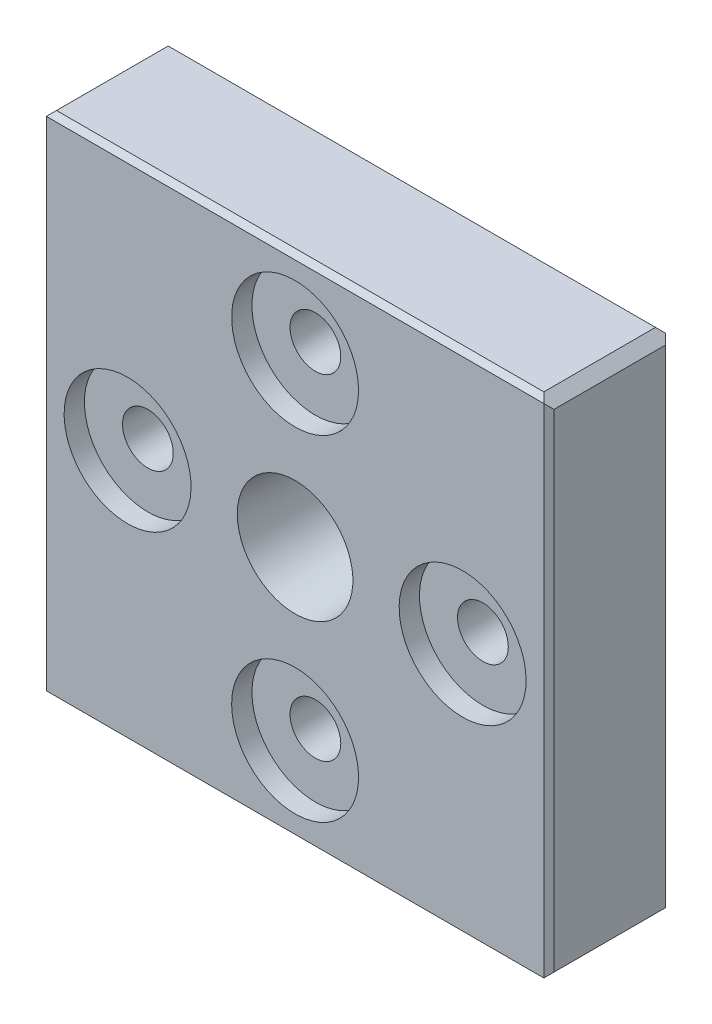
ISO-10303-21;
HEADER;
FILE_DESCRIPTION(('STEP AP214'),'2;1');
FILE_NAME('part.step','',(''),(''),'','','');
FILE_SCHEMA(('AUTOMOTIVE_DESIGN { 1 0 10303 214 1 1 1 1 }'));
ENDSEC;
DATA;
#1=APPLICATION_CONTEXT('core data for automotive mechanical design processes');
#2=APPLICATION_PROTOCOL_DEFINITION('international standard','automotive_design',2000,#1);
#3=PRODUCT_CONTEXT('',#1,'mechanical');
#4=PRODUCT('Part','Part','',(#3));
#5=PRODUCT_RELATED_PRODUCT_CATEGORY('part','',(#4));
#6=PRODUCT_DEFINITION_FORMATION('','',#4);
#7=PRODUCT_DEFINITION_CONTEXT('part definition',#1,'design');
#8=PRODUCT_DEFINITION('design','',#6,#7);
#9=PRODUCT_DEFINITION_SHAPE('','',#8);
#10=(LENGTH_UNIT() NAMED_UNIT(*) SI_UNIT(.MILLI.,.METRE.));
#11=(NAMED_UNIT(*) PLANE_ANGLE_UNIT() SI_UNIT($,.RADIAN.));
#12=(NAMED_UNIT(*) SI_UNIT($,.STERADIAN.) SOLID_ANGLE_UNIT());
#13=UNCERTAINTY_MEASURE_WITH_UNIT(LENGTH_MEASURE(1.E-05),#10,'distance_accuracy_value','');
#14=(GEOMETRIC_REPRESENTATION_CONTEXT(3) GLOBAL_UNCERTAINTY_ASSIGNED_CONTEXT((#13)) GLOBAL_UNIT_ASSIGNED_CONTEXT((#10,
#11,#12)) REPRESENTATION_CONTEXT('',''));
#15=CARTESIAN_POINT('',(0.,0.,0.));
#16=DIRECTION('',(0.,0.,1.));
#17=DIRECTION('',(1.,0.,0.));
#18=AXIS2_PLACEMENT_3D('',#15,#16,#17);
#19=CARTESIAN_POINT('',(0.,0.,-6.00100000000001));
#20=DIRECTION('',(0.,0.,1.));
#21=DIRECTION('',(0.999999999999999,0.,0.));
#22=AXIS2_PLACEMENT_3D('',#19,#20,#21);
#23=CYLINDRICAL_SURFACE('',#22,5.);
#24=CARTESIAN_POINT('',(0.,0.,-6.00000000000001));
#25=DIRECTION('',(0.,0.,-1.));
#26=DIRECTION('',(-0.999999999999999,0.,0.));
#27=AXIS2_PLACEMENT_3D('',#24,#25,#26);
#28=CIRCLE('',#27,5.);
#29=CARTESIAN_POINT('',(-4.99999999999998,0.,-6.00000000000001));
#30=VERTEX_POINT('',#29);
#31=EDGE_CURVE('E315',#30,#30,#28,.F.);
#32=ORIENTED_EDGE('',*,*,#31,.F.);
#33=EDGE_LOOP('',(#32));
#34=FACE_BOUND('',#33,.T.);
#35=CARTESIAN_POINT('',(0.,0.,-2.8));
#36=DIRECTION('',(0.,0.,1.));
#37=DIRECTION('',(-0.999999999999999,0.,0.));
#38=AXIS2_PLACEMENT_3D('',#35,#36,#37);
#39=CIRCLE('',#38,5.);
#40=CARTESIAN_POINT('',(-4.99999999999998,0.,-2.8));
#41=VERTEX_POINT('',#40);
#42=EDGE_CURVE('E12',#41,#41,#39,.T.);
#43=ORIENTED_EDGE('',*,*,#42,.T.);
#44=EDGE_LOOP('',(#43));
#45=FACE_BOUND('',#44,.T.);
#46=ADVANCED_FACE('F50',(#34,#45),#23,.F.);
#47=CARTESIAN_POINT('',(0.,-16.5,6.00000000000001));
#48=DIRECTION('',(0.,0.,1.));
#49=DIRECTION('',(0.999999999999999,0.,0.));
#50=AXIS2_PLACEMENT_3D('',#47,#48,#49);
#51=CYLINDRICAL_SURFACE('',#50,2.5);
#52=CARTESIAN_POINT('',(0.,-16.5,-6.00000000000001));
#53=DIRECTION('',(0.,0.,1.));
#54=DIRECTION('',(0.999999999999999,0.,0.));
#55=AXIS2_PLACEMENT_3D('',#52,#53,#54);
#56=CIRCLE('',#55,2.5);
#57=CARTESIAN_POINT('',(2.5,-16.5,-6.00000000000001));
#58=VERTEX_POINT('',#57);
#59=EDGE_CURVE('E311',#58,#58,#56,.T.);
#60=ORIENTED_EDGE('',*,*,#59,.F.);
#61=EDGE_LOOP('',(#60));
#62=FACE_BOUND('',#61,.T.);
#63=CARTESIAN_POINT('',(0.,-16.5,4.));
#64=DIRECTION('',(0.,0.,1.));
#65=DIRECTION('',(0.999999999999999,0.,0.));
#66=AXIS2_PLACEMENT_3D('',#63,#64,#65);
#67=CIRCLE('',#66,2.5);
#68=CARTESIAN_POINT('',(2.5,-16.5,4.));
#69=VERTEX_POINT('',#68);
#70=EDGE_CURVE('E282',#69,#69,#67,.F.);
#71=ORIENTED_EDGE('',*,*,#70,.F.);
#72=EDGE_LOOP('',(#71));
#73=FACE_BOUND('',#72,.T.);
#74=ADVANCED_FACE('F386',(#62,#73),#51,.F.);
#75=CARTESIAN_POINT('',(16.5,0.,6.00000000000002));
#76=DIRECTION('',(0.,0.,1.));
#77=DIRECTION('',(0.999999999999999,0.,0.));
#78=AXIS2_PLACEMENT_3D('',#75,#76,#77);
#79=CYLINDRICAL_SURFACE('',#78,2.5);
#80=CARTESIAN_POINT('',(16.5,0.,-5.99999999999998));
#81=DIRECTION('',(0.,0.,1.));
#82=DIRECTION('',(0.999999999999999,0.,0.));
#83=AXIS2_PLACEMENT_3D('',#80,#81,#82);
#84=CIRCLE('',#83,2.5);
#85=CARTESIAN_POINT('',(19.,0.,-5.99999999999998));
#86=VERTEX_POINT('',#85);
#87=EDGE_CURVE('E307',#86,#86,#84,.T.);
#88=ORIENTED_EDGE('',*,*,#87,.F.);
#89=EDGE_LOOP('',(#88));
#90=FACE_BOUND('',#89,.T.);
#91=CARTESIAN_POINT('',(16.5,0.,4.00000000000002));
#92=DIRECTION('',(0.,0.,1.));
#93=DIRECTION('',(0.999999999999999,0.,0.));
#94=AXIS2_PLACEMENT_3D('',#91,#92,#93);
#95=CIRCLE('',#94,2.5);
#96=CARTESIAN_POINT('',(19.,0.,4.00000000000002));
#97=VERTEX_POINT('',#96);
#98=EDGE_CURVE('E277',#97,#97,#95,.F.);
#99=ORIENTED_EDGE('',*,*,#98,.F.);
#100=EDGE_LOOP('',(#99));
#101=FACE_BOUND('',#100,.T.);
#102=ADVANCED_FACE('F395',(#90,#101),#79,.F.);
#103=CARTESIAN_POINT('',(-16.5,0.,6.00000000000001));
#104=DIRECTION('',(0.,0.,1.));
#105=DIRECTION('',(0.999999999999999,0.,0.));
#106=AXIS2_PLACEMENT_3D('',#103,#104,#105);
#107=CYLINDRICAL_SURFACE('',#106,2.5);
#108=CARTESIAN_POINT('',(-16.5,0.,-5.99999999999999));
#109=DIRECTION('',(0.,0.,1.));
#110=DIRECTION('',(0.999999999999999,0.,0.));
#111=AXIS2_PLACEMENT_3D('',#108,#109,#110);
#112=CIRCLE('',#111,2.5);
#113=CARTESIAN_POINT('',(-14.,0.,-5.99999999999999));
#114=VERTEX_POINT('',#113);
#115=EDGE_CURVE('E271',#114,#114,#112,.T.);
#116=ORIENTED_EDGE('',*,*,#115,.F.);
#117=EDGE_LOOP('',(#116));
#118=FACE_BOUND('',#117,.T.);
#119=CARTESIAN_POINT('',(-16.5,0.,4.));
#120=DIRECTION('',(0.,0.,1.));
#121=DIRECTION('',(0.999999999999999,0.,0.));
#122=AXIS2_PLACEMENT_3D('',#119,#120,#121);
#123=CIRCLE('',#122,2.5);
#124=CARTESIAN_POINT('',(-14.,0.,4.));
#125=VERTEX_POINT('',#124);
#126=EDGE_CURVE('E273',#125,#125,#123,.F.);
#127=ORIENTED_EDGE('',*,*,#126,.F.);
#128=EDGE_LOOP('',(#127));
#129=FACE_BOUND('',#128,.T.);
#130=ADVANCED_FACE('F644',(#118,#129),#107,.F.);
#131=CARTESIAN_POINT('',(0.,16.5,6.00000000000001));
#132=DIRECTION('',(0.,0.,1.));
#133=DIRECTION('',(0.999999999999999,0.,0.));
#134=AXIS2_PLACEMENT_3D('',#131,#132,#133);
#135=CYLINDRICAL_SURFACE('',#134,2.5);
#136=CARTESIAN_POINT('',(0.,16.5,-6.00000000000001));
#137=DIRECTION('',(0.,0.,1.));
#138=DIRECTION('',(0.999999999999999,0.,0.));
#139=AXIS2_PLACEMENT_3D('',#136,#137,#138);
#140=CIRCLE('',#139,2.5);
#141=CARTESIAN_POINT('',(2.5,16.5,-6.00000000000001));
#142=VERTEX_POINT('',#141);
#143=EDGE_CURVE('E303',#142,#142,#140,.T.);
#144=ORIENTED_EDGE('',*,*,#143,.F.);
#145=EDGE_LOOP('',(#144));
#146=FACE_BOUND('',#145,.T.);
#147=CARTESIAN_POINT('',(0.,16.5,4.));
#148=DIRECTION('',(0.,0.,1.));
#149=DIRECTION('',(0.999999999999999,0.,0.));
#150=AXIS2_PLACEMENT_3D('',#147,#148,#149);
#151=CIRCLE('',#150,2.5);
#152=CARTESIAN_POINT('',(2.50000000000001,16.5,4.));
#153=VERTEX_POINT('',#152);
#154=EDGE_CURVE('E267',#153,#153,#151,.F.);
#155=ORIENTED_EDGE('',*,*,#154,.F.);
#156=EDGE_LOOP('',(#155));
#157=FACE_BOUND('',#156,.T.);
#158=ADVANCED_FACE('F421',(#146,#157),#135,.F.);
#159=CARTESIAN_POINT('',(25.,-25.,6.00000000000002));
#160=DIRECTION('',(-0.999999999999999,0.,0.));
#161=DIRECTION('',(0.,0.,1.));
#162=AXIS2_PLACEMENT_3D('',#159,#160,#161);
#163=PLANE('',#162);
#164=DIRECTION('',(0.,0.,-1.));
#165=VECTOR('',#164,1.);
#166=CARTESIAN_POINT('',(25.,-24.,6.00000000000002));
#167=LINE('',#166,#165);
#168=CARTESIAN_POINT('',(25.,-24.,5.50000000000001));
#169=VERTEX_POINT('',#168);
#170=CARTESIAN_POINT('',(25.,-24.,-5.49999999999998));
#171=VERTEX_POINT('',#170);
#172=EDGE_CURVE('E161',#169,#171,#167,.T.);
#173=ORIENTED_EDGE('',*,*,#172,.T.);
#174=DIRECTION('',(0.,0.999999999999999,0.));
#175=VECTOR('',#174,1.);
#176=CARTESIAN_POINT('',(25.,24.,-5.49999999999999));
#177=LINE('',#176,#175);
#178=CARTESIAN_POINT('',(25.,24.,-5.49999999999999));
#179=VERTEX_POINT('',#178);
#180=EDGE_CURVE('E258',#171,#179,#177,.T.);
#181=ORIENTED_EDGE('',*,*,#180,.T.);
#182=DIRECTION('',(0.,0.,1.));
#183=VECTOR('',#182,1.);
#184=CARTESIAN_POINT('',(25.,24.,6.00000000000002));
#185=LINE('',#184,#183);
#186=CARTESIAN_POINT('',(25.,24.,5.49999999999999));
#187=VERTEX_POINT('',#186);
#188=EDGE_CURVE('E319',#179,#187,#185,.T.);
#189=ORIENTED_EDGE('',*,*,#188,.T.);
#190=DIRECTION('',(0.,-0.999999999999999,0.));
#191=VECTOR('',#190,1.);
#192=CARTESIAN_POINT('',(25.,-25.,5.50000000000001));
#193=LINE('',#192,#191);
#194=EDGE_CURVE('E255',#187,#169,#193,.T.);
#195=ORIENTED_EDGE('',*,*,#194,.T.);
#196=EDGE_LOOP('',(#173,#181,#189,#195));
#197=FACE_BOUND('',#196,.T.);
#198=ADVANCED_FACE('F370',(#197),#163,.F.);
#199=CARTESIAN_POINT('',(-25.,25.,6.00000000000001));
#200=DIRECTION('',(0.,-0.999999999999999,0.));
#201=DIRECTION('',(0.,0.,-1.));
#202=AXIS2_PLACEMENT_3D('',#199,#200,#201);
#203=PLANE('',#202);
#204=DIRECTION('',(0.,0.,-1.));
#205=VECTOR('',#204,1.);
#206=CARTESIAN_POINT('',(24.,25.,6.00000000000002));
#207=LINE('',#206,#205);
#208=CARTESIAN_POINT('',(24.,25.,5.50000000000002));
#209=VERTEX_POINT('',#208);
#210=CARTESIAN_POINT('',(24.,25.,-5.49999999999999));
#211=VERTEX_POINT('',#210);
#212=EDGE_CURVE('E339',#209,#211,#207,.T.);
#213=ORIENTED_EDGE('',*,*,#212,.T.);
#214=DIRECTION('',(-0.999999999999999,0.,0.));
#215=VECTOR('',#214,1.);
#216=CARTESIAN_POINT('',(-24.,25.,-5.49999999999999));
#217=LINE('',#216,#215);
#218=CARTESIAN_POINT('',(-24.,25.,-5.49999999999999));
#219=VERTEX_POINT('',#218);
#220=EDGE_CURVE('E228',#211,#219,#217,.T.);
#221=ORIENTED_EDGE('',*,*,#220,.T.);
#222=DIRECTION('',(0.,0.,1.));
#223=VECTOR('',#222,1.);
#224=CARTESIAN_POINT('',(-24.,25.,6.00000000000001));
#225=LINE('',#224,#223);
#226=CARTESIAN_POINT('',(-24.,25.,5.50000000000001));
#227=VERTEX_POINT('',#226);
#228=EDGE_CURVE('E343',#219,#227,#225,.T.);
#229=ORIENTED_EDGE('',*,*,#228,.T.);
#230=DIRECTION('',(0.999999999999999,0.,0.));
#231=VECTOR('',#230,1.);
#232=CARTESIAN_POINT('',(-25.,25.,5.50000000000001));
#233=LINE('',#232,#231);
#234=EDGE_CURVE('E225',#227,#209,#233,.T.);
#235=ORIENTED_EDGE('',*,*,#234,.T.);
#236=EDGE_LOOP('',(#213,#221,#229,#235));
#237=FACE_BOUND('',#236,.T.);
#238=ADVANCED_FACE('F414',(#237),#203,.F.);
#239=CARTESIAN_POINT('',(-25.,-25.,6.00000000000001));
#240=DIRECTION('',(0.999999999999999,0.,0.));
#241=DIRECTION('',(0.,0.,-1.));
#242=AXIS2_PLACEMENT_3D('',#239,#240,#241);
#243=PLANE('',#242);
#244=DIRECTION('',(0.,0.,-1.));
#245=VECTOR('',#244,1.);
#246=CARTESIAN_POINT('',(-25.,24.,6.00000000000001));
#247=LINE('',#246,#245);
#248=CARTESIAN_POINT('',(-25.,24.,5.49999999999999));
#249=VERTEX_POINT('',#248);
#250=CARTESIAN_POINT('',(-25.,24.,-5.49999999999999));
#251=VERTEX_POINT('',#250);
#252=EDGE_CURVE('E331',#249,#251,#247,.T.);
#253=ORIENTED_EDGE('',*,*,#252,.T.);
#254=DIRECTION('',(0.,-0.999999999999999,0.));
#255=VECTOR('',#254,1.);
#256=CARTESIAN_POINT('',(-25.,-24.,-5.49999999999998));
#257=LINE('',#256,#255);
#258=CARTESIAN_POINT('',(-25.,-24.,-5.49999999999998));
#259=VERTEX_POINT('',#258);
#260=EDGE_CURVE('E60',#251,#259,#257,.T.);
#261=ORIENTED_EDGE('',*,*,#260,.T.);
#262=DIRECTION('',(0.,0.,1.));
#263=VECTOR('',#262,1.);
#264=CARTESIAN_POINT('',(-25.,-24.,6.00000000000001));
#265=LINE('',#264,#263);
#266=CARTESIAN_POINT('',(-25.,-24.,5.50000000000001));
#267=VERTEX_POINT('',#266);
#268=EDGE_CURVE('E335',#259,#267,#265,.T.);
#269=ORIENTED_EDGE('',*,*,#268,.T.);
#270=DIRECTION('',(0.,0.999999999999999,0.));
#271=VECTOR('',#270,1.);
#272=CARTESIAN_POINT('',(-25.,-25.,5.50000000000001));
#273=LINE('',#272,#271);
#274=EDGE_CURVE('E261',#267,#249,#273,.T.);
#275=ORIENTED_EDGE('',*,*,#274,.T.);
#276=EDGE_LOOP('',(#253,#261,#269,#275));
#277=FACE_BOUND('',#276,.T.);
#278=ADVANCED_FACE('F411',(#277),#243,.F.);
#279=CARTESIAN_POINT('',(-25.,-25.,6.00000000000001));
#280=DIRECTION('',(0.,0.999999999999999,0.));
#281=DIRECTION('',(0.,0.,1.));
#282=AXIS2_PLACEMENT_3D('',#279,#280,#281);
#283=PLANE('',#282);
#284=DIRECTION('',(0.,0.,1.));
#285=VECTOR('',#284,1.);
#286=CARTESIAN_POINT('',(24.,-25.,6.00000000000002));
#287=LINE('',#286,#285);
#288=CARTESIAN_POINT('',(24.,-25.,-5.49999999999998));
#289=VERTEX_POINT('',#288);
#290=CARTESIAN_POINT('',(24.,-25.,5.50000000000002));
#291=VERTEX_POINT('',#290);
#292=EDGE_CURVE('E328',#289,#291,#287,.T.);
#293=ORIENTED_EDGE('',*,*,#292,.T.);
#294=DIRECTION('',(-0.999999999999999,0.,0.));
#295=VECTOR('',#294,1.);
#296=CARTESIAN_POINT('',(-25.,-25.,5.50000000000001));
#297=LINE('',#296,#295);
#298=CARTESIAN_POINT('',(-24.,-25.,5.50000000000001));
#299=VERTEX_POINT('',#298);
#300=EDGE_CURVE('E149',#291,#299,#297,.T.);
#301=ORIENTED_EDGE('',*,*,#300,.T.);
#302=DIRECTION('',(0.,0.,-1.));
#303=VECTOR('',#302,1.);
#304=CARTESIAN_POINT('',(-24.,-25.,6.00000000000001));
#305=LINE('',#304,#303);
#306=CARTESIAN_POINT('',(-24.,-25.,-5.49999999999998));
#307=VERTEX_POINT('',#306);
#308=EDGE_CURVE('E324',#299,#307,#305,.T.);
#309=ORIENTED_EDGE('',*,*,#308,.T.);
#310=DIRECTION('',(0.999999999999999,0.,0.));
#311=VECTOR('',#310,1.);
#312=CARTESIAN_POINT('',(24.,-25.,-5.49999999999998));
#313=LINE('',#312,#311);
#314=EDGE_CURVE('E191',#307,#289,#313,.T.);
#315=ORIENTED_EDGE('',*,*,#314,.T.);
#316=EDGE_LOOP('',(#293,#301,#309,#315));
#317=FACE_BOUND('',#316,.T.);
#318=ADVANCED_FACE('F363',(#317),#283,.F.);
#319=CARTESIAN_POINT('',(0.,0.,6.00000000000001));
#320=DIRECTION('',(0.,0.,-1.));
#321=DIRECTION('',(-0.999999999999999,0.,0.));
#322=AXIS2_PLACEMENT_3D('',#319,#320,#321);
#323=PLANE('',#322);
#324=CARTESIAN_POINT('',(-16.5,0.,6.00000000000001));
#325=DIRECTION('',(0.,0.,1.));
#326=DIRECTION('',(0.,0.999999999999999,0.));
#327=AXIS2_PLACEMENT_3D('',#324,#325,#326);
#328=CIRCLE('',#327,6.25);
#329=CARTESIAN_POINT('',(-16.5,6.24999999999994,6.00000000000001));
#330=VERTEX_POINT('',#329);
#331=EDGE_CURVE('E595',#330,#330,#328,.T.);
#332=ORIENTED_EDGE('',*,*,#331,.F.);
#333=EDGE_LOOP('',(#332));
#334=FACE_BOUND('',#333,.T.);
#335=CARTESIAN_POINT('',(0.,-16.5,6.00000000000001));
#336=DIRECTION('',(0.,0.,1.));
#337=DIRECTION('',(-0.999999999999999,0.,0.));
#338=AXIS2_PLACEMENT_3D('',#335,#336,#337);
#339=CIRCLE('',#338,6.25);
#340=CARTESIAN_POINT('',(-6.24999999999998,-16.5,6.00000000000001));
#341=VERTEX_POINT('',#340);
#342=EDGE_CURVE('E585',#341,#341,#339,.T.);
#343=ORIENTED_EDGE('',*,*,#342,.F.);
#344=EDGE_LOOP('',(#343));
#345=FACE_BOUND('',#344,.T.);
#346=CARTESIAN_POINT('',(16.5,1.80411241501588E-13,6.00000000000002));
#347=DIRECTION('',(0.,0.,1.));
#348=DIRECTION('',(0.,-0.999999999999999,0.));
#349=AXIS2_PLACEMENT_3D('',#346,#347,#348);
#350=CIRCLE('',#349,6.25);
#351=CARTESIAN_POINT('',(16.5000000000001,-6.24999999999981,6.00000000000002));
#352=VERTEX_POINT('',#351);
#353=EDGE_CURVE('E577',#352,#352,#350,.T.);
#354=ORIENTED_EDGE('',*,*,#353,.F.);
#355=EDGE_LOOP('',(#354));
#356=FACE_BOUND('',#355,.T.);
#357=CARTESIAN_POINT('',(0.,16.5,6.00000000000001));
#358=DIRECTION('',(0.,0.,1.));
#359=DIRECTION('',(0.999999999999999,0.,0.));
#360=AXIS2_PLACEMENT_3D('',#357,#358,#359);
#361=CIRCLE('',#360,6.25);
#362=CARTESIAN_POINT('',(6.25000000000001,16.5,6.00000000000001));
#363=VERTEX_POINT('',#362);
#364=EDGE_CURVE('E285',#363,#363,#361,.T.);
#365=ORIENTED_EDGE('',*,*,#364,.F.);
#366=EDGE_LOOP('',(#365));
#367=FACE_BOUND('',#366,.T.);
#368=CARTESIAN_POINT('',(0.,0.,6.00000000000001));
#369=DIRECTION('',(0.,0.,-1.));
#370=DIRECTION('',(-0.999999999999999,0.,0.));
#371=AXIS2_PLACEMENT_3D('',#368,#369,#370);
#372=CIRCLE('',#371,5.69257502005664);
#373=CARTESIAN_POINT('',(-5.69257502005664,0.,6.00000000000001));
#374=VERTEX_POINT('',#373);
#375=EDGE_CURVE('E54',#374,#374,#372,.F.);
#376=ORIENTED_EDGE('',*,*,#375,.F.);
#377=EDGE_LOOP('',(#376));
#378=FACE_BOUND('',#377,.T.);
#379=DIRECTION('',(0.999999999999999,0.,0.));
#380=VECTOR('',#379,1.);
#381=CARTESIAN_POINT('',(0.,-24.5,6.00000000000001));
#382=LINE('',#381,#380);
#383=CARTESIAN_POINT('',(-24.5,-24.5,6.00000000000001));
#384=VERTEX_POINT('',#383);
#385=CARTESIAN_POINT('',(24.5,-24.5,6.00000000000002));
#386=VERTEX_POINT('',#385);
#387=EDGE_CURVE('E148',#384,#386,#382,.T.);
#388=ORIENTED_EDGE('',*,*,#387,.T.);
#389=DIRECTION('',(0.,0.999999999999999,0.));
#390=VECTOR('',#389,1.);
#391=CARTESIAN_POINT('',(24.5,0.,6.00000000000002));
#392=LINE('',#391,#390);
#393=CARTESIAN_POINT('',(24.5,24.5,6.00000000000002));
#394=VERTEX_POINT('',#393);
#395=EDGE_CURVE('E166',#386,#394,#392,.T.);
#396=ORIENTED_EDGE('',*,*,#395,.T.);
#397=DIRECTION('',(-0.999999999999999,0.,0.));
#398=VECTOR('',#397,1.);
#399=CARTESIAN_POINT('',(0.,24.5,6.00000000000001));
#400=LINE('',#399,#398);
#401=CARTESIAN_POINT('',(-24.5,24.5,6.00000000000001));
#402=VERTEX_POINT('',#401);
#403=EDGE_CURVE('E177',#394,#402,#400,.T.);
#404=ORIENTED_EDGE('',*,*,#403,.T.);
#405=DIRECTION('',(0.,-0.999999999999999,0.));
#406=VECTOR('',#405,1.);
#407=CARTESIAN_POINT('',(-24.5,0.,6.00000000000001));
#408=LINE('',#407,#406);
#409=EDGE_CURVE('E175',#402,#384,#408,.T.);
#410=ORIENTED_EDGE('',*,*,#409,.T.);
#411=EDGE_LOOP('',(#388,#396,#404,#410));
#412=FACE_BOUND('',#411,.T.);
#413=ADVANCED_FACE('F171',(#334,#345,#356,#367,#378,#412),#323,.F.);
#414=CARTESIAN_POINT('',(0.,0.,-6.00000000000001));
#415=DIRECTION('',(0.,0.,-1.));
#416=DIRECTION('',(-0.999999999999999,0.,0.));
#417=AXIS2_PLACEMENT_3D('',#414,#415,#416);
#418=PLANE('',#417);
#419=ORIENTED_EDGE('',*,*,#115,.T.);
#420=EDGE_LOOP('',(#419));
#421=FACE_BOUND('',#420,.T.);
#422=ORIENTED_EDGE('',*,*,#143,.T.);
#423=EDGE_LOOP('',(#422));
#424=FACE_BOUND('',#423,.T.);
#425=ORIENTED_EDGE('',*,*,#87,.T.);
#426=EDGE_LOOP('',(#425));
#427=FACE_BOUND('',#426,.T.);
#428=ORIENTED_EDGE('',*,*,#59,.T.);
#429=EDGE_LOOP('',(#428));
#430=FACE_BOUND('',#429,.T.);
#431=ORIENTED_EDGE('',*,*,#31,.T.);
#432=EDGE_LOOP('',(#431));
#433=FACE_BOUND('',#432,.T.);
#434=DIRECTION('',(0.999999999999999,0.,0.));
#435=VECTOR('',#434,1.);
#436=CARTESIAN_POINT('',(24.,24.5,-5.99999999999999));
#437=LINE('',#436,#435);
#438=CARTESIAN_POINT('',(-24.5,24.5,-5.99999999999999));
#439=VERTEX_POINT('',#438);
#440=CARTESIAN_POINT('',(24.5,24.5,-5.99999999999999));
#441=VERTEX_POINT('',#440);
#442=EDGE_CURVE('E215',#439,#441,#437,.T.);
#443=ORIENTED_EDGE('',*,*,#442,.T.);
#444=DIRECTION('',(0.,-0.999999999999999,0.));
#445=VECTOR('',#444,1.);
#446=CARTESIAN_POINT('',(24.5,-24.,-5.99999999999998));
#447=LINE('',#446,#445);
#448=CARTESIAN_POINT('',(24.5,-24.5,-5.99999999999998));
#449=VERTEX_POINT('',#448);
#450=EDGE_CURVE('E222',#441,#449,#447,.T.);
#451=ORIENTED_EDGE('',*,*,#450,.T.);
#452=DIRECTION('',(-0.999999999999999,0.,0.));
#453=VECTOR('',#452,1.);
#454=CARTESIAN_POINT('',(-24.,-24.5,-5.99999999999998));
#455=LINE('',#454,#453);
#456=CARTESIAN_POINT('',(-24.5,-24.5,-5.99999999999998));
#457=VERTEX_POINT('',#456);
#458=EDGE_CURVE('E219',#449,#457,#455,.T.);
#459=ORIENTED_EDGE('',*,*,#458,.T.);
#460=DIRECTION('',(0.,0.999999999999999,0.));
#461=VECTOR('',#460,1.);
#462=CARTESIAN_POINT('',(-24.5,24.,-5.99999999999999));
#463=LINE('',#462,#461);
#464=EDGE_CURVE('E211',#457,#439,#463,.T.);
#465=ORIENTED_EDGE('',*,*,#464,.T.);
#466=EDGE_LOOP('',(#443,#451,#459,#465));
#467=FACE_BOUND('',#466,.T.);
#468=ADVANCED_FACE('F404',(#421,#424,#427,#430,#433,#467),#418,.T.);
#469=CARTESIAN_POINT('',(0.,0.,-2.8));
#470=DIRECTION('',(0.,0.,1.));
#471=DIRECTION('',(0.999999999999999,0.,0.));
#472=AXIS2_PLACEMENT_3D('',#469,#470,#471);
#473=CONICAL_SURFACE('',#472,5.,0.078539816339745);
#474=ORIENTED_EDGE('',*,*,#42,.F.);
#475=EDGE_LOOP('',(#474));
#476=FACE_BOUND('',#475,.T.);
#477=ORIENTED_EDGE('',*,*,#375,.T.);
#478=EDGE_LOOP('',(#477));
#479=FACE_BOUND('',#478,.T.);
#480=ADVANCED_FACE('F52',(#476,#479),#473,.F.);
#481=CARTESIAN_POINT('',(25.,-24.,6.00000000000002));
#482=DIRECTION('',(-0.707106781186545,0.70710678118655,0.));
#483=DIRECTION('',(0.,0.,-1.));
#484=AXIS2_PLACEMENT_3D('',#481,#482,#483);
#485=PLANE('',#484);
#486=ORIENTED_EDGE('',*,*,#292,.F.);
#487=DIRECTION('',(-0.577350269189628,-0.577350269189624,0.577350269189625));
#488=VECTOR('',#487,1.);
#489=CARTESIAN_POINT('',(20.8333333333333,-28.1666666666666,-2.33333333333333));
#490=LINE('',#489,#488);
#491=EDGE_CURVE('E187',#289,#449,#490,.F.);
#492=ORIENTED_EDGE('',*,*,#491,.T.);
#493=DIRECTION('',(-0.577350269189626,-0.577350269189623,-0.577350269189627));
#494=VECTOR('',#493,1.);
#495=CARTESIAN_POINT('',(28.8333333333333,-20.1666666666667,-1.66666666666662));
#496=LINE('',#495,#494);
#497=EDGE_CURVE('E154',#449,#171,#496,.F.);
#498=ORIENTED_EDGE('',*,*,#497,.T.);
#499=ORIENTED_EDGE('',*,*,#172,.F.);
#500=DIRECTION('',(-0.577350269189624,-0.57735026918962,0.577350269189633));
#501=VECTOR('',#500,1.);
#502=CARTESIAN_POINT('',(24.8333333333333,-24.1666666666666,5.66666666666668));
#503=LINE('',#502,#501);
#504=EDGE_CURVE('E155',#169,#386,#503,.T.);
#505=ORIENTED_EDGE('',*,*,#504,.T.);
#506=DIRECTION('',(-0.577350269189625,-0.577350269189621,-0.57735026918963));
#507=VECTOR('',#506,1.);
#508=CARTESIAN_POINT('',(24.8333333333333,-24.1666666666666,6.33333333333336));
#509=LINE('',#508,#507);
#510=EDGE_CURVE('E143',#386,#291,#509,.T.);
#511=ORIENTED_EDGE('',*,*,#510,.T.);
#512=EDGE_LOOP('',(#486,#492,#498,#499,#505,#511));
#513=FACE_BOUND('',#512,.T.);
#514=ADVANCED_FACE('F159',(#513),#485,.F.);
#515=CARTESIAN_POINT('',(-24.,-25.,6.00000000000001));
#516=DIRECTION('',(0.70710678118655,0.707106781186545,0.));
#517=DIRECTION('',(0.,0.,-1.));
#518=AXIS2_PLACEMENT_3D('',#515,#516,#517);
#519=PLANE('',#518);
#520=DIRECTION('',(-0.577350269189624,0.577350269189628,0.577350269189625));
#521=VECTOR('',#520,1.);
#522=CARTESIAN_POINT('',(-28.1666666666666,-20.8333333333333,-2.33333333333333));
#523=LINE('',#522,#521);
#524=EDGE_CURVE('E204',#259,#457,#523,.F.);
#525=ORIENTED_EDGE('',*,*,#524,.T.);
#526=DIRECTION('',(-0.577350269189623,0.577350269189627,-0.577350269189627));
#527=VECTOR('',#526,1.);
#528=CARTESIAN_POINT('',(-20.1666666666667,-28.8333333333333,-1.66666666666665));
#529=LINE('',#528,#527);
#530=EDGE_CURVE('E208',#457,#307,#529,.F.);
#531=ORIENTED_EDGE('',*,*,#530,.T.);
#532=ORIENTED_EDGE('',*,*,#308,.F.);
#533=DIRECTION('',(-0.57735026918962,0.577350269189624,0.577350269189633));
#534=VECTOR('',#533,1.);
#535=CARTESIAN_POINT('',(-24.1666666666666,-24.8333333333333,5.66666666666668));
#536=LINE('',#535,#534);
#537=EDGE_CURVE('E200',#299,#384,#536,.T.);
#538=ORIENTED_EDGE('',*,*,#537,.T.);
#539=DIRECTION('',(-0.577350269189621,0.577350269189625,-0.57735026918963));
#540=VECTOR('',#539,1.);
#541=CARTESIAN_POINT('',(-24.1666666666666,-24.8333333333333,6.33333333333333));
#542=LINE('',#541,#540);
#543=EDGE_CURVE('E197',#384,#267,#542,.T.);
#544=ORIENTED_EDGE('',*,*,#543,.T.);
#545=ORIENTED_EDGE('',*,*,#268,.F.);
#546=EDGE_LOOP('',(#525,#531,#532,#538,#544,#545));
#547=FACE_BOUND('',#546,.T.);
#548=ADVANCED_FACE('F359',(#547),#519,.F.);
#549=CARTESIAN_POINT('',(-25.,24.,6.00000000000001));
#550=DIRECTION('',(0.707106781186545,-0.70710678118655,0.));
#551=DIRECTION('',(0.,0.,-1.));
#552=AXIS2_PLACEMENT_3D('',#549,#550,#551);
#553=PLANE('',#552);
#554=ORIENTED_EDGE('',*,*,#228,.F.);
#555=DIRECTION('',(0.577350269189628,0.577350269189624,0.577350269189625));
#556=VECTOR('',#555,1.);
#557=CARTESIAN_POINT('',(-20.8333333333333,28.1666666666666,-2.33333333333335));
#558=LINE('',#557,#556);
#559=EDGE_CURVE('E242',#219,#439,#558,.F.);
#560=ORIENTED_EDGE('',*,*,#559,.T.);
#561=DIRECTION('',(0.577350269189627,0.577350269189623,-0.577350269189627));
#562=VECTOR('',#561,1.);
#563=CARTESIAN_POINT('',(-28.8333333333333,20.1666666666666,-1.66666666666664));
#564=LINE('',#563,#562);
#565=EDGE_CURVE('E239',#439,#251,#564,.F.);
#566=ORIENTED_EDGE('',*,*,#565,.T.);
#567=ORIENTED_EDGE('',*,*,#252,.F.);
#568=DIRECTION('',(0.577350269189624,0.57735026918962,0.577350269189633));
#569=VECTOR('',#568,1.);
#570=CARTESIAN_POINT('',(-24.8333333333333,24.1666666666666,5.66666666666667));
#571=LINE('',#570,#569);
#572=EDGE_CURVE('E232',#249,#402,#571,.T.);
#573=ORIENTED_EDGE('',*,*,#572,.T.);
#574=DIRECTION('',(0.577350269189625,0.577350269189621,-0.57735026918963));
#575=VECTOR('',#574,1.);
#576=CARTESIAN_POINT('',(-24.8333333333333,24.1666666666666,6.33333333333334));
#577=LINE('',#576,#575);
#578=EDGE_CURVE('E236',#402,#227,#577,.T.);
#579=ORIENTED_EDGE('',*,*,#578,.T.);
#580=EDGE_LOOP('',(#554,#560,#566,#567,#573,#579));
#581=FACE_BOUND('',#580,.T.);
#582=ADVANCED_FACE('F433',(#581),#553,.F.);
#583=CARTESIAN_POINT('',(24.,25.,6.00000000000002));
#584=DIRECTION('',(-0.70710678118655,-0.707106781186545,0.));
#585=DIRECTION('',(0.,0.,-1.));
#586=AXIS2_PLACEMENT_3D('',#583,#584,#585);
#587=PLANE('',#586);
#588=DIRECTION('',(0.577350269189624,-0.577350269189628,0.577350269189625));
#589=VECTOR('',#588,1.);
#590=CARTESIAN_POINT('',(28.1666666666666,20.8333333333333,-2.33333333333334));
#591=LINE('',#590,#589);
#592=EDGE_CURVE('E75',#179,#441,#591,.F.);
#593=ORIENTED_EDGE('',*,*,#592,.T.);
#594=DIRECTION('',(0.577350269189623,-0.577350269189627,-0.577350269189627));
#595=VECTOR('',#594,1.);
#596=CARTESIAN_POINT('',(20.1666666666667,28.8333333333333,-1.66666666666662));
#597=LINE('',#596,#595);
#598=EDGE_CURVE('E252',#441,#211,#597,.F.);
#599=ORIENTED_EDGE('',*,*,#598,.T.);
#600=ORIENTED_EDGE('',*,*,#212,.F.);
#601=DIRECTION('',(0.57735026918962,-0.577350269189624,0.577350269189633));
#602=VECTOR('',#601,1.);
#603=CARTESIAN_POINT('',(24.1666666666667,24.8333333333333,5.66666666666669));
#604=LINE('',#603,#602);
#605=EDGE_CURVE('E247',#209,#394,#604,.T.);
#606=ORIENTED_EDGE('',*,*,#605,.T.);
#607=DIRECTION('',(0.577350269189622,-0.577350269189625,-0.57735026918963));
#608=VECTOR('',#607,1.);
#609=CARTESIAN_POINT('',(24.1666666666667,24.8333333333333,6.33333333333334));
#610=LINE('',#609,#608);
#611=EDGE_CURVE('E67',#394,#187,#610,.T.);
#612=ORIENTED_EDGE('',*,*,#611,.T.);
#613=ORIENTED_EDGE('',*,*,#188,.F.);
#614=EDGE_LOOP('',(#593,#599,#600,#606,#612,#613));
#615=FACE_BOUND('',#614,.T.);
#616=ADVANCED_FACE('F439',(#615),#587,.F.);
#617=CARTESIAN_POINT('',(0.,-24.5,6.00000000000001));
#618=DIRECTION('',(0.,0.707106781186552,-0.707106781186543));
#619=DIRECTION('',(0.999999999999999,0.,0.));
#620=AXIS2_PLACEMENT_3D('',#617,#618,#619);
#621=PLANE('',#620);
#622=ORIENTED_EDGE('',*,*,#537,.F.);
#623=ORIENTED_EDGE('',*,*,#300,.F.);
#624=ORIENTED_EDGE('',*,*,#510,.F.);
#625=ORIENTED_EDGE('',*,*,#387,.F.);
#626=EDGE_LOOP('',(#622,#623,#624,#625));
#627=FACE_BOUND('',#626,.T.);
#628=ADVANCED_FACE('F146',(#627),#621,.F.);
#629=CARTESIAN_POINT('',(-25.,-25.,-5.49999999999998));
#630=DIRECTION('',(0.,-0.707106781186547,-0.707106781186547));
#631=DIRECTION('',(-0.999999999999999,0.,0.));
#632=AXIS2_PLACEMENT_3D('',#629,#630,#631);
#633=PLANE('',#632);
#634=ORIENTED_EDGE('',*,*,#530,.F.);
#635=ORIENTED_EDGE('',*,*,#458,.F.);
#636=ORIENTED_EDGE('',*,*,#491,.F.);
#637=ORIENTED_EDGE('',*,*,#314,.F.);
#638=EDGE_LOOP('',(#634,#635,#636,#637));
#639=FACE_BOUND('',#638,.T.);
#640=ADVANCED_FACE('F365',(#639),#633,.T.);
#641=CARTESIAN_POINT('',(-25.,25.,-5.49999999999999));
#642=DIRECTION('',(0.,0.707106781186547,-0.707106781186547));
#643=DIRECTION('',(0.999999999999999,0.,0.));
#644=AXIS2_PLACEMENT_3D('',#641,#642,#643);
#645=PLANE('',#644);
#646=ORIENTED_EDGE('',*,*,#598,.F.);
#647=ORIENTED_EDGE('',*,*,#442,.F.);
#648=ORIENTED_EDGE('',*,*,#559,.F.);
#649=ORIENTED_EDGE('',*,*,#220,.F.);
#650=EDGE_LOOP('',(#646,#647,#648,#649));
#651=FACE_BOUND('',#650,.T.);
#652=ADVANCED_FACE('F382',(#651),#645,.T.);
#653=CARTESIAN_POINT('',(0.,24.5,6.00000000000001));
#654=DIRECTION('',(0.,-0.707106781186552,-0.707106781186543));
#655=DIRECTION('',(-0.999999999999999,0.,0.));
#656=AXIS2_PLACEMENT_3D('',#653,#654,#655);
#657=PLANE('',#656);
#658=ORIENTED_EDGE('',*,*,#605,.F.);
#659=ORIENTED_EDGE('',*,*,#234,.F.);
#660=ORIENTED_EDGE('',*,*,#578,.F.);
#661=ORIENTED_EDGE('',*,*,#403,.F.);
#662=EDGE_LOOP('',(#658,#659,#660,#661));
#663=FACE_BOUND('',#662,.T.);
#664=ADVANCED_FACE('F373',(#663),#657,.F.);
#665=CARTESIAN_POINT('',(25.,-25.,-5.49999999999998));
#666=DIRECTION('',(0.707106781186547,0.,-0.707106781186547));
#667=DIRECTION('',(0.,-0.999999999999999,0.));
#668=AXIS2_PLACEMENT_3D('',#665,#666,#667);
#669=PLANE('',#668);
#670=ORIENTED_EDGE('',*,*,#497,.F.);
#671=ORIENTED_EDGE('',*,*,#450,.F.);
#672=ORIENTED_EDGE('',*,*,#592,.F.);
#673=ORIENTED_EDGE('',*,*,#180,.F.);
#674=EDGE_LOOP('',(#670,#671,#672,#673));
#675=FACE_BOUND('',#674,.T.);
#676=ADVANCED_FACE('F371',(#675),#669,.T.);
#677=CARTESIAN_POINT('',(24.5,0.,6.00000000000002));
#678=DIRECTION('',(-0.707106781186552,0.,-0.707106781186543));
#679=DIRECTION('',(0.,0.999999999999999,0.));
#680=AXIS2_PLACEMENT_3D('',#677,#678,#679);
#681=PLANE('',#680);
#682=ORIENTED_EDGE('',*,*,#504,.F.);
#683=ORIENTED_EDGE('',*,*,#194,.F.);
#684=ORIENTED_EDGE('',*,*,#611,.F.);
#685=ORIENTED_EDGE('',*,*,#395,.F.);
#686=EDGE_LOOP('',(#682,#683,#684,#685));
#687=FACE_BOUND('',#686,.T.);
#688=ADVANCED_FACE('F179',(#687),#681,.F.);
#689=CARTESIAN_POINT('',(-25.,-25.,-5.49999999999998));
#690=DIRECTION('',(-0.707106781186547,0.,-0.707106781186547));
#691=DIRECTION('',(0.,0.999999999999999,0.));
#692=AXIS2_PLACEMENT_3D('',#689,#690,#691);
#693=PLANE('',#692);
#694=ORIENTED_EDGE('',*,*,#565,.F.);
#695=ORIENTED_EDGE('',*,*,#464,.F.);
#696=ORIENTED_EDGE('',*,*,#524,.F.);
#697=ORIENTED_EDGE('',*,*,#260,.F.);
#698=EDGE_LOOP('',(#694,#695,#696,#697));
#699=FACE_BOUND('',#698,.T.);
#700=ADVANCED_FACE('F380',(#699),#693,.T.);
#701=CARTESIAN_POINT('',(-24.5,0.,6.00000000000001));
#702=DIRECTION('',(0.707106781186552,0.,-0.707106781186543));
#703=DIRECTION('',(0.,-0.999999999999999,0.));
#704=AXIS2_PLACEMENT_3D('',#701,#702,#703);
#705=PLANE('',#704);
#706=ORIENTED_EDGE('',*,*,#572,.F.);
#707=ORIENTED_EDGE('',*,*,#274,.F.);
#708=ORIENTED_EDGE('',*,*,#543,.F.);
#709=ORIENTED_EDGE('',*,*,#409,.F.);
#710=EDGE_LOOP('',(#706,#707,#708,#709));
#711=FACE_BOUND('',#710,.T.);
#712=ADVANCED_FACE('F354',(#711),#705,.F.);
#713=CARTESIAN_POINT('',(0.,16.5,4.));
#714=DIRECTION('',(0.,0.,1.));
#715=DIRECTION('',(0.999999999999999,0.,0.));
#716=AXIS2_PLACEMENT_3D('',#713,#714,#715);
#717=PLANE('',#716);
#718=CARTESIAN_POINT('',(0.,16.5,4.));
#719=DIRECTION('',(0.,0.,1.));
#720=DIRECTION('',(0.999999999999999,0.,0.));
#721=AXIS2_PLACEMENT_3D('',#718,#719,#720);
#722=CIRCLE('',#721,6.25);
#723=CARTESIAN_POINT('',(6.25000000000001,16.5,4.));
#724=VERTEX_POINT('',#723);
#725=EDGE_CURVE('E272',#724,#724,#722,.T.);
#726=ORIENTED_EDGE('',*,*,#725,.T.);
#727=EDGE_LOOP('',(#726));
#728=FACE_BOUND('',#727,.T.);
#729=ORIENTED_EDGE('',*,*,#154,.T.);
#730=EDGE_LOOP('',(#729));
#731=FACE_BOUND('',#730,.T.);
#732=ADVANCED_FACE('F476',(#728,#731),#717,.T.);
#733=CARTESIAN_POINT('',(0.,16.5,4.));
#734=DIRECTION('',(0.,0.,1.));
#735=DIRECTION('',(0.999999999999999,0.,0.));
#736=AXIS2_PLACEMENT_3D('',#733,#734,#735);
#737=CYLINDRICAL_SURFACE('',#736,6.25);
#738=ORIENTED_EDGE('',*,*,#725,.F.);
#739=EDGE_LOOP('',(#738));
#740=FACE_BOUND('',#739,.T.);
#741=ORIENTED_EDGE('',*,*,#364,.T.);
#742=EDGE_LOOP('',(#741));
#743=FACE_BOUND('',#742,.T.);
#744=ADVANCED_FACE('F483',(#740,#743),#737,.F.);
#745=CARTESIAN_POINT('',(-16.5,0.,4.));
#746=DIRECTION('',(0.,0.,1.));
#747=DIRECTION('',(0.,0.999999999999999,0.));
#748=AXIS2_PLACEMENT_3D('',#745,#746,#747);
#749=PLANE('',#748);
#750=CARTESIAN_POINT('',(-16.5,0.,4.));
#751=DIRECTION('',(0.,0.,1.));
#752=DIRECTION('',(0.,0.999999999999999,0.));
#753=AXIS2_PLACEMENT_3D('',#750,#751,#752);
#754=CIRCLE('',#753,6.25);
#755=CARTESIAN_POINT('',(-16.5,6.24999999999994,4.));
#756=VERTEX_POINT('',#755);
#757=EDGE_CURVE('E278',#756,#756,#754,.T.);
#758=ORIENTED_EDGE('',*,*,#757,.T.);
#759=EDGE_LOOP('',(#758));
#760=FACE_BOUND('',#759,.T.);
#761=ORIENTED_EDGE('',*,*,#126,.T.);
#762=EDGE_LOOP('',(#761));
#763=FACE_BOUND('',#762,.T.);
#764=ADVANCED_FACE('F608',(#760,#763),#749,.T.);
#765=CARTESIAN_POINT('',(-16.5,0.,4.));
#766=DIRECTION('',(0.,0.,1.));
#767=DIRECTION('',(0.999999999999999,0.,0.));
#768=AXIS2_PLACEMENT_3D('',#765,#766,#767);
#769=CYLINDRICAL_SURFACE('',#768,6.25);
#770=ORIENTED_EDGE('',*,*,#757,.F.);
#771=EDGE_LOOP('',(#770));
#772=FACE_BOUND('',#771,.T.);
#773=ORIENTED_EDGE('',*,*,#331,.T.);
#774=EDGE_LOOP('',(#773));
#775=FACE_BOUND('',#774,.T.);
#776=ADVANCED_FACE('F611',(#772,#775),#769,.F.);
#777=CARTESIAN_POINT('',(16.5,1.76941794549634E-13,4.00000000000002));
#778=DIRECTION('',(0.,0.,1.));
#779=DIRECTION('',(0.,-0.999999999999999,0.));
#780=AXIS2_PLACEMENT_3D('',#777,#778,#779);
#781=PLANE('',#780);
#782=CARTESIAN_POINT('',(16.5,1.76941794549634E-13,4.00000000000002));
#783=DIRECTION('',(0.,0.,1.));
#784=DIRECTION('',(0.,-0.999999999999999,0.));
#785=AXIS2_PLACEMENT_3D('',#782,#783,#784);
#786=CIRCLE('',#785,6.25);
#787=CARTESIAN_POINT('',(16.5000000000001,-6.24999999999982,4.00000000000002));
#788=VERTEX_POINT('',#787);
#789=EDGE_CURVE('E581',#788,#788,#786,.T.);
#790=ORIENTED_EDGE('',*,*,#789,.T.);
#791=EDGE_LOOP('',(#790));
#792=FACE_BOUND('',#791,.T.);
#793=ORIENTED_EDGE('',*,*,#98,.T.);
#794=EDGE_LOOP('',(#793));
#795=FACE_BOUND('',#794,.T.);
#796=ADVANCED_FACE('F614',(#792,#795),#781,.T.);
#797=CARTESIAN_POINT('',(16.5,1.76941794549634E-13,4.00000000000002));
#798=DIRECTION('',(0.,0.,1.));
#799=DIRECTION('',(0.999999999999999,0.,0.));
#800=AXIS2_PLACEMENT_3D('',#797,#798,#799);
#801=CYLINDRICAL_SURFACE('',#800,6.25);
#802=ORIENTED_EDGE('',*,*,#789,.F.);
#803=EDGE_LOOP('',(#802));
#804=FACE_BOUND('',#803,.T.);
#805=ORIENTED_EDGE('',*,*,#353,.T.);
#806=EDGE_LOOP('',(#805));
#807=FACE_BOUND('',#806,.T.);
#808=ADVANCED_FACE('F623',(#804,#807),#801,.F.);
#809=CARTESIAN_POINT('',(0.,-16.5,4.));
#810=DIRECTION('',(0.,0.,1.));
#811=DIRECTION('',(-0.999999999999999,0.,0.));
#812=AXIS2_PLACEMENT_3D('',#809,#810,#811);
#813=PLANE('',#812);
#814=CARTESIAN_POINT('',(0.,-16.5,4.));
#815=DIRECTION('',(0.,0.,1.));
#816=DIRECTION('',(-0.999999999999999,0.,0.));
#817=AXIS2_PLACEMENT_3D('',#814,#815,#816);
#818=CIRCLE('',#817,6.25);
#819=CARTESIAN_POINT('',(-6.25,-16.5,4.));
#820=VERTEX_POINT('',#819);
#821=EDGE_CURVE('E590',#820,#820,#818,.T.);
#822=ORIENTED_EDGE('',*,*,#821,.T.);
#823=EDGE_LOOP('',(#822));
#824=FACE_BOUND('',#823,.T.);
#825=ORIENTED_EDGE('',*,*,#70,.T.);
#826=EDGE_LOOP('',(#825));
#827=FACE_BOUND('',#826,.T.);
#828=ADVANCED_FACE('F625',(#824,#827),#813,.T.);
#829=CARTESIAN_POINT('',(0.,-16.5,4.));
#830=DIRECTION('',(0.,0.,1.));
#831=DIRECTION('',(0.999999999999999,0.,0.));
#832=AXIS2_PLACEMENT_3D('',#829,#830,#831);
#833=CYLINDRICAL_SURFACE('',#832,6.25);
#834=ORIENTED_EDGE('',*,*,#821,.F.);
#835=EDGE_LOOP('',(#834));
#836=FACE_BOUND('',#835,.T.);
#837=ORIENTED_EDGE('',*,*,#342,.T.);
#838=EDGE_LOOP('',(#837));
#839=FACE_BOUND('',#838,.T.);
#840=ADVANCED_FACE('F633',(#836,#839),#833,.F.);
#841=CLOSED_SHELL('',(#46,#74,#102,#130,#158,#198,#238,#278,#318,#413,#468,#480,#514,#548,#582,
#616,#628,#640,#652,#664,#676,#688,#700,#712,#732,#744,#764,#776,#796,#808,#828,#840));
#842=MANIFOLD_SOLID_BREP('B2',#841);
#843=ADVANCED_BREP_SHAPE_REPRESENTATION('',(#18,#842),#14);
#844=SHAPE_DEFINITION_REPRESENTATION(#9,#843);
ENDSEC;
END-ISO-10303-21;
